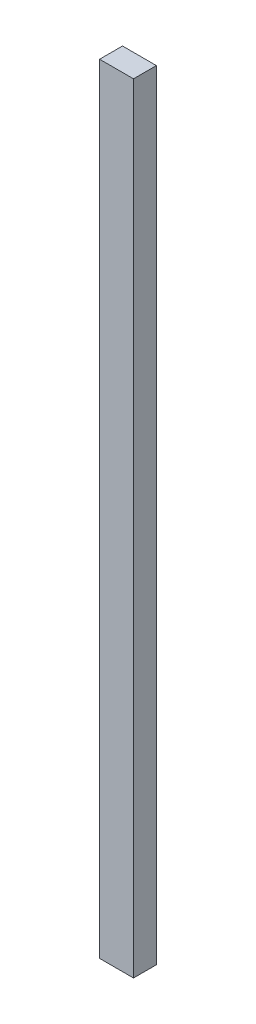
ISO-10303-21;
HEADER;
FILE_DESCRIPTION(('STEP AP214'),'2;1');
FILE_NAME('part.step','',(''),(''),'','','');
FILE_SCHEMA(('AUTOMOTIVE_DESIGN { 1 0 10303 214 1 1 1 1 }'));
ENDSEC;
DATA;
#1=APPLICATION_CONTEXT('core data for automotive mechanical design processes');
#2=APPLICATION_PROTOCOL_DEFINITION('international standard','automotive_design',2000,#1);
#3=PRODUCT_CONTEXT('',#1,'mechanical');
#4=PRODUCT('Part','Part','',(#3));
#5=PRODUCT_RELATED_PRODUCT_CATEGORY('part','',(#4));
#6=PRODUCT_DEFINITION_FORMATION('','',#4);
#7=PRODUCT_DEFINITION_CONTEXT('part definition',#1,'design');
#8=PRODUCT_DEFINITION('design','',#6,#7);
#9=PRODUCT_DEFINITION_SHAPE('','',#8);
#10=(LENGTH_UNIT() NAMED_UNIT(*) SI_UNIT(.MILLI.,.METRE.));
#11=(NAMED_UNIT(*) PLANE_ANGLE_UNIT() SI_UNIT($,.RADIAN.));
#12=(NAMED_UNIT(*) SI_UNIT($,.STERADIAN.) SOLID_ANGLE_UNIT());
#13=UNCERTAINTY_MEASURE_WITH_UNIT(LENGTH_MEASURE(1.E-05),#10,'distance_accuracy_value','');
#14=(GEOMETRIC_REPRESENTATION_CONTEXT(3) GLOBAL_UNCERTAINTY_ASSIGNED_CONTEXT((#13)) GLOBAL_UNIT_ASSIGNED_CONTEXT((#10,
#11,#12)) REPRESENTATION_CONTEXT('',''));
#15=CARTESIAN_POINT('',(0.,0.,0.));
#16=DIRECTION('',(0.,0.,1.));
#17=DIRECTION('',(1.,0.,0.));
#18=AXIS2_PLACEMENT_3D('',#15,#16,#17);
#19=CARTESIAN_POINT('',(2.3495,107.95,1.5875));
#20=DIRECTION('',(-1.,0.,0.));
#21=DIRECTION('',(0.,0.,1.));
#22=AXIS2_PLACEMENT_3D('',#19,#20,#21);
#23=PLANE('',#22);
#24=DIRECTION('',(0.,0.,-1.));
#25=VECTOR('',#24,1.);
#26=CARTESIAN_POINT('',(2.3495,0.,1.5875));
#27=LINE('',#26,#25);
#28=CARTESIAN_POINT('',(2.3495,0.,1.5875));
#29=VERTEX_POINT('',#28);
#30=CARTESIAN_POINT('',(2.3495,0.,-1.5875));
#31=VERTEX_POINT('',#30);
#32=EDGE_CURVE('E106',#29,#31,#27,.T.);
#33=ORIENTED_EDGE('',*,*,#32,.T.);
#34=DIRECTION('',(0.,-1.,0.));
#35=VECTOR('',#34,1.);
#36=CARTESIAN_POINT('',(2.3495,107.95,-1.5875));
#37=LINE('',#36,#35);
#38=CARTESIAN_POINT('',(2.3495,107.95,-1.5875));
#39=VERTEX_POINT('',#38);
#40=EDGE_CURVE('E11',#39,#31,#37,.T.);
#41=ORIENTED_EDGE('',*,*,#40,.F.);
#42=DIRECTION('',(0.,0.,-1.));
#43=VECTOR('',#42,1.);
#44=CARTESIAN_POINT('',(2.3495,107.95,1.5875));
#45=LINE('',#44,#43);
#46=CARTESIAN_POINT('',(2.3495,107.95,1.5875));
#47=VERTEX_POINT('',#46);
#48=EDGE_CURVE('E94',#47,#39,#45,.T.);
#49=ORIENTED_EDGE('',*,*,#48,.F.);
#50=DIRECTION('',(0.,-1.,0.));
#51=VECTOR('',#50,1.);
#52=CARTESIAN_POINT('',(2.3495,107.95,1.5875));
#53=LINE('',#52,#51);
#54=EDGE_CURVE('E102',#47,#29,#53,.T.);
#55=ORIENTED_EDGE('',*,*,#54,.T.);
#56=EDGE_LOOP('',(#33,#41,#49,#55));
#57=FACE_BOUND('',#56,.T.);
#58=ADVANCED_FACE('F43',(#57),#23,.F.);
#59=CARTESIAN_POINT('',(-2.3495,107.95,-1.5875));
#60=DIRECTION('',(0.,0.,1.));
#61=DIRECTION('',(1.,0.,0.));
#62=AXIS2_PLACEMENT_3D('',#59,#60,#61);
#63=PLANE('',#62);
#64=DIRECTION('',(-1.,0.,0.));
#65=VECTOR('',#64,1.);
#66=CARTESIAN_POINT('',(-2.3495,0.,-1.5875));
#67=LINE('',#66,#65);
#68=CARTESIAN_POINT('',(-2.3495,0.,-1.5875));
#69=VERTEX_POINT('',#68);
#70=EDGE_CURVE('E98',#31,#69,#67,.T.);
#71=ORIENTED_EDGE('',*,*,#70,.T.);
#72=DIRECTION('',(0.,-1.,0.));
#73=VECTOR('',#72,1.);
#74=CARTESIAN_POINT('',(-2.3495,107.95,-1.5875));
#75=LINE('',#74,#73);
#76=CARTESIAN_POINT('',(-2.3495,107.95,-1.5875));
#77=VERTEX_POINT('',#76);
#78=EDGE_CURVE('E51',#77,#69,#75,.T.);
#79=ORIENTED_EDGE('',*,*,#78,.F.);
#80=DIRECTION('',(-1.,0.,0.));
#81=VECTOR('',#80,1.);
#82=CARTESIAN_POINT('',(-2.3495,107.95,-1.5875));
#83=LINE('',#82,#81);
#84=EDGE_CURVE('E89',#39,#77,#83,.T.);
#85=ORIENTED_EDGE('',*,*,#84,.F.);
#86=ORIENTED_EDGE('',*,*,#40,.T.);
#87=EDGE_LOOP('',(#71,#79,#85,#86));
#88=FACE_BOUND('',#87,.T.);
#89=ADVANCED_FACE('F97',(#88),#63,.F.);
#90=CARTESIAN_POINT('',(-2.3495,107.95,1.5875));
#91=DIRECTION('',(1.,0.,0.));
#92=DIRECTION('',(0.,0.,-1.));
#93=AXIS2_PLACEMENT_3D('',#90,#91,#92);
#94=PLANE('',#93);
#95=DIRECTION('',(0.,0.,1.));
#96=VECTOR('',#95,1.);
#97=CARTESIAN_POINT('',(-2.3495,0.,1.5875));
#98=LINE('',#97,#96);
#99=CARTESIAN_POINT('',(-2.3495,0.,1.5875));
#100=VERTEX_POINT('',#99);
#101=EDGE_CURVE('E76',#69,#100,#98,.T.);
#102=ORIENTED_EDGE('',*,*,#101,.T.);
#103=DIRECTION('',(0.,-1.,0.));
#104=VECTOR('',#103,1.);
#105=CARTESIAN_POINT('',(-2.3495,107.95,1.5875));
#106=LINE('',#105,#104);
#107=CARTESIAN_POINT('',(-2.3495,107.95,1.5875));
#108=VERTEX_POINT('',#107);
#109=EDGE_CURVE('E99',#108,#100,#106,.T.);
#110=ORIENTED_EDGE('',*,*,#109,.F.);
#111=DIRECTION('',(0.,0.,1.));
#112=VECTOR('',#111,1.);
#113=CARTESIAN_POINT('',(-2.3495,107.95,1.5875));
#114=LINE('',#113,#112);
#115=EDGE_CURVE('E92',#77,#108,#114,.T.);
#116=ORIENTED_EDGE('',*,*,#115,.F.);
#117=ORIENTED_EDGE('',*,*,#78,.T.);
#118=EDGE_LOOP('',(#102,#110,#116,#117));
#119=FACE_BOUND('',#118,.T.);
#120=ADVANCED_FACE('F100',(#119),#94,.F.);
#121=CARTESIAN_POINT('',(-2.3495,107.95,1.5875));
#122=DIRECTION('',(0.,0.,-1.));
#123=DIRECTION('',(-1.,0.,0.));
#124=AXIS2_PLACEMENT_3D('',#121,#122,#123);
#125=PLANE('',#124);
#126=DIRECTION('',(1.,0.,0.));
#127=VECTOR('',#126,1.);
#128=CARTESIAN_POINT('',(-2.3495,0.,1.5875));
#129=LINE('',#128,#127);
#130=EDGE_CURVE('E82',#100,#29,#129,.T.);
#131=ORIENTED_EDGE('',*,*,#130,.T.);
#132=ORIENTED_EDGE('',*,*,#54,.F.);
#133=DIRECTION('',(1.,0.,0.));
#134=VECTOR('',#133,1.);
#135=CARTESIAN_POINT('',(-2.3495,107.95,1.5875));
#136=LINE('',#135,#134);
#137=EDGE_CURVE('E59',#108,#47,#136,.T.);
#138=ORIENTED_EDGE('',*,*,#137,.F.);
#139=ORIENTED_EDGE('',*,*,#109,.T.);
#140=EDGE_LOOP('',(#131,#132,#138,#139));
#141=FACE_BOUND('',#140,.T.);
#142=ADVANCED_FACE('F113',(#141),#125,.F.);
#143=CARTESIAN_POINT('',(0.,107.95,0.));
#144=DIRECTION('',(0.,-1.,0.));
#145=DIRECTION('',(0.,0.,-1.));
#146=AXIS2_PLACEMENT_3D('',#143,#144,#145);
#147=PLANE('',#146);
#148=ORIENTED_EDGE('',*,*,#48,.T.);
#149=ORIENTED_EDGE('',*,*,#84,.T.);
#150=ORIENTED_EDGE('',*,*,#115,.T.);
#151=ORIENTED_EDGE('',*,*,#137,.T.);
#152=EDGE_LOOP('',(#148,#149,#150,#151));
#153=FACE_BOUND('',#152,.T.);
#154=ADVANCED_FACE('F90',(#153),#147,.F.);
#155=CARTESIAN_POINT('',(0.,0.,0.));
#156=DIRECTION('',(0.,-1.,0.));
#157=DIRECTION('',(0.,0.,-1.));
#158=AXIS2_PLACEMENT_3D('',#155,#156,#157);
#159=PLANE('',#158);
#160=ORIENTED_EDGE('',*,*,#32,.F.);
#161=ORIENTED_EDGE('',*,*,#130,.F.);
#162=ORIENTED_EDGE('',*,*,#101,.F.);
#163=ORIENTED_EDGE('',*,*,#70,.F.);
#164=EDGE_LOOP('',(#160,#161,#162,#163));
#165=FACE_BOUND('',#164,.T.);
#166=ADVANCED_FACE('F116',(#165),#159,.T.);
#167=CLOSED_SHELL('',(#58,#89,#120,#142,#154,#166));
#168=MANIFOLD_SOLID_BREP('B2',#167);
#169=ADVANCED_BREP_SHAPE_REPRESENTATION('',(#18,#168),#14);
#170=SHAPE_DEFINITION_REPRESENTATION(#9,#169);
ENDSEC;
END-ISO-10303-21;
